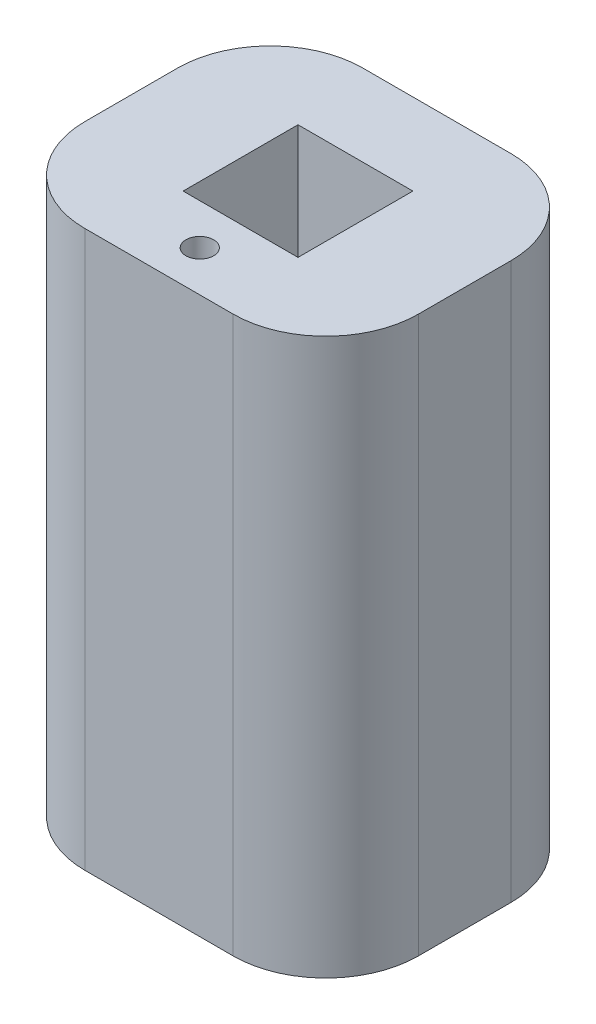
ISO-10303-21;
HEADER;
FILE_DESCRIPTION(('STEP AP214'),'2;1');
FILE_NAME('part.step','',(''),(''),'','','');
FILE_SCHEMA(('AUTOMOTIVE_DESIGN { 1 0 10303 214 1 1 1 1 }'));
ENDSEC;
DATA;
#1=APPLICATION_CONTEXT('core data for automotive mechanical design processes');
#2=APPLICATION_PROTOCOL_DEFINITION('international standard','automotive_design',2000,#1);
#3=PRODUCT_CONTEXT('',#1,'mechanical');
#4=PRODUCT('Part','Part','',(#3));
#5=PRODUCT_RELATED_PRODUCT_CATEGORY('part','',(#4));
#6=PRODUCT_DEFINITION_FORMATION('','',#4);
#7=PRODUCT_DEFINITION_CONTEXT('part definition',#1,'design');
#8=PRODUCT_DEFINITION('design','',#6,#7);
#9=PRODUCT_DEFINITION_SHAPE('','',#8);
#10=(LENGTH_UNIT() NAMED_UNIT(*) SI_UNIT(.MILLI.,.METRE.));
#11=(NAMED_UNIT(*) PLANE_ANGLE_UNIT() SI_UNIT($,.RADIAN.));
#12=(NAMED_UNIT(*) SI_UNIT($,.STERADIAN.) SOLID_ANGLE_UNIT());
#13=UNCERTAINTY_MEASURE_WITH_UNIT(LENGTH_MEASURE(1.E-05),#10,'distance_accuracy_value','');
#14=(GEOMETRIC_REPRESENTATION_CONTEXT(3) GLOBAL_UNCERTAINTY_ASSIGNED_CONTEXT((#13)) GLOBAL_UNIT_ASSIGNED_CONTEXT((#10,
#11,#12)) REPRESENTATION_CONTEXT('',''));
#15=CARTESIAN_POINT('',(0.,0.,0.));
#16=DIRECTION('',(0.,0.,1.));
#17=DIRECTION('',(1.,0.,0.));
#18=AXIS2_PLACEMENT_3D('',#15,#16,#17);
#19=CARTESIAN_POINT('',(-40.554301947245,68.1515906405771,15.));
#20=DIRECTION('',(1.,0.,0.));
#21=DIRECTION('',(0.,1.,0.));
#22=AXIS2_PLACEMENT_3D('',#19,#20,#21);
#23=PLANE('',#22);
#24=DIRECTION('',(0.,0.,-1.));
#25=VECTOR('',#24,1.);
#26=CARTESIAN_POINT('',(-40.554301947245,38.1515906405771,15.));
#27=LINE('',#26,#25);
#28=CARTESIAN_POINT('',(-40.554301947245,38.1515906405771,10.));
#29=VERTEX_POINT('',#28);
#30=CARTESIAN_POINT('',(-40.554301947245,38.1515906405771,5.));
#31=VERTEX_POINT('',#30);
#32=EDGE_CURVE('E190',#29,#31,#27,.T.);
#33=ORIENTED_EDGE('',*,*,#32,.F.);
#34=DIRECTION('',(0.,-1.,0.));
#35=VECTOR('',#34,1.);
#36=CARTESIAN_POINT('',(-40.554301947245,68.1515906405771,10.));
#37=LINE('',#36,#35);
#38=CARTESIAN_POINT('',(-40.554301947245,68.1515906405771,10.));
#39=VERTEX_POINT('',#38);
#40=EDGE_CURVE('E11',#29,#39,#37,.F.);
#41=ORIENTED_EDGE('',*,*,#40,.T.);
#42=DIRECTION('',(0.,0.,-1.));
#43=VECTOR('',#42,1.);
#44=CARTESIAN_POINT('',(-40.554301947245,68.1515906405771,15.));
#45=LINE('',#44,#43);
#46=CARTESIAN_POINT('',(-40.554301947245,68.1515906405771,5.));
#47=VERTEX_POINT('',#46);
#48=EDGE_CURVE('E177',#39,#47,#45,.T.);
#49=ORIENTED_EDGE('',*,*,#48,.T.);
#50=DIRECTION('',(0.,-1.,0.));
#51=VECTOR('',#50,1.);
#52=CARTESIAN_POINT('',(-40.554301947245,38.1515906405771,5.));
#53=LINE('',#52,#51);
#54=EDGE_CURVE('E44',#47,#31,#53,.T.);
#55=ORIENTED_EDGE('',*,*,#54,.T.);
#56=EDGE_LOOP('',(#33,#41,#49,#55));
#57=FACE_BOUND('',#56,.T.);
#58=ADVANCED_FACE('F35',(#57),#23,.F.);
#59=CARTESIAN_POINT('',(-22.554301947245,38.1515906405771,15.));
#60=DIRECTION('',(0.,1.,0.));
#61=DIRECTION('',(0.,0.,1.));
#62=AXIS2_PLACEMENT_3D('',#59,#60,#61);
#63=PLANE('',#62);
#64=CARTESIAN_POINT('',(-31.554301947245,38.1515906405771,12.8));
#65=DIRECTION('',(0.,-1.,0.));
#66=DIRECTION('',(0.,0.,-1.));
#67=AXIS2_PLACEMENT_3D('',#64,#65,#66);
#68=CIRCLE('',#67,0.750000000000002);
#69=CARTESIAN_POINT('',(-31.554301947245,38.1515906405771,12.05));
#70=VERTEX_POINT('',#69);
#71=EDGE_CURVE('E398',#70,#70,#68,.T.);
#72=ORIENTED_EDGE('',*,*,#71,.F.);
#73=EDGE_LOOP('',(#72));
#74=FACE_BOUND('',#73,.T.);
#75=DIRECTION('',(-1.,0.,0.));
#76=VECTOR('',#75,1.);
#77=CARTESIAN_POINT('',(-34.654301947245,38.1515906405771,10.6));
#78=LINE('',#77,#76);
#79=CARTESIAN_POINT('',(-28.454301947245,38.1515906405771,10.6));
#80=VERTEX_POINT('',#79);
#81=CARTESIAN_POINT('',(-34.654301947245,38.1515906405771,10.6));
#82=VERTEX_POINT('',#81);
#83=EDGE_CURVE('E134',#80,#82,#78,.T.);
#84=ORIENTED_EDGE('',*,*,#83,.F.);
#85=DIRECTION('',(0.,0.,1.));
#86=VECTOR('',#85,1.);
#87=CARTESIAN_POINT('',(-28.454301947245,38.1515906405771,4.4));
#88=LINE('',#87,#86);
#89=CARTESIAN_POINT('',(-28.454301947245,38.1515906405771,4.4));
#90=VERTEX_POINT('',#89);
#91=EDGE_CURVE('E154',#90,#80,#88,.T.);
#92=ORIENTED_EDGE('',*,*,#91,.F.);
#93=DIRECTION('',(1.,0.,0.));
#94=VECTOR('',#93,1.);
#95=CARTESIAN_POINT('',(-34.654301947245,38.1515906405771,4.4));
#96=LINE('',#95,#94);
#97=CARTESIAN_POINT('',(-34.654301947245,38.1515906405771,4.4));
#98=VERTEX_POINT('',#97);
#99=EDGE_CURVE('E162',#98,#90,#96,.T.);
#100=ORIENTED_EDGE('',*,*,#99,.F.);
#101=DIRECTION('',(0.,0.,-1.));
#102=VECTOR('',#101,1.);
#103=CARTESIAN_POINT('',(-34.654301947245,38.1515906405771,4.4));
#104=LINE('',#103,#102);
#105=EDGE_CURVE('E160',#82,#98,#104,.T.);
#106=ORIENTED_EDGE('',*,*,#105,.F.);
#107=EDGE_LOOP('',(#84,#92,#100,#106));
#108=FACE_BOUND('',#107,.T.);
#109=DIRECTION('',(0.,0.,-1.));
#110=VECTOR('',#109,1.);
#111=CARTESIAN_POINT('',(-22.554301947245,38.1515906405771,15.));
#112=LINE('',#111,#110);
#113=CARTESIAN_POINT('',(-22.554301947245,38.1515906405771,10.));
#114=VERTEX_POINT('',#113);
#115=CARTESIAN_POINT('',(-22.554301947245,38.1515906405771,5.));
#116=VERTEX_POINT('',#115);
#117=EDGE_CURVE('E187',#114,#116,#112,.T.);
#118=ORIENTED_EDGE('',*,*,#117,.F.);
#119=CARTESIAN_POINT('',(-27.554301947245,38.1515906405771,10.));
#120=DIRECTION('',(0.,1.,0.));
#121=DIRECTION('',(0.,0.,1.));
#122=AXIS2_PLACEMENT_3D('',#119,#120,#121);
#123=CIRCLE('',#122,5.);
#124=CARTESIAN_POINT('',(-27.554301947245,38.1515906405771,15.));
#125=VERTEX_POINT('',#124);
#126=EDGE_CURVE('E215',#114,#125,#123,.F.);
#127=ORIENTED_EDGE('',*,*,#126,.T.);
#128=DIRECTION('',(1.,0.,0.));
#129=VECTOR('',#128,1.);
#130=CARTESIAN_POINT('',(-22.554301947245,38.1515906405771,15.));
#131=LINE('',#130,#129);
#132=CARTESIAN_POINT('',(-35.554301947245,38.1515906405771,15.));
#133=VERTEX_POINT('',#132);
#134=EDGE_CURVE('E170',#133,#125,#131,.T.);
#135=ORIENTED_EDGE('',*,*,#134,.F.);
#136=CARTESIAN_POINT('',(-35.554301947245,38.1515906405771,10.));
#137=DIRECTION('',(0.,1.,0.));
#138=DIRECTION('',(0.,0.,1.));
#139=AXIS2_PLACEMENT_3D('',#136,#137,#138);
#140=CIRCLE('',#139,5.);
#141=EDGE_CURVE('E59',#133,#29,#140,.F.);
#142=ORIENTED_EDGE('',*,*,#141,.T.);
#143=ORIENTED_EDGE('',*,*,#32,.T.);
#144=CARTESIAN_POINT('',(-35.554301947245,38.1515906405771,5.));
#145=DIRECTION('',(0.,1.,0.));
#146=DIRECTION('',(0.,0.,1.));
#147=AXIS2_PLACEMENT_3D('',#144,#145,#146);
#148=CIRCLE('',#147,5.);
#149=CARTESIAN_POINT('',(-35.554301947245,38.1515906405771,0.));
#150=VERTEX_POINT('',#149);
#151=EDGE_CURVE('E51',#31,#150,#148,.F.);
#152=ORIENTED_EDGE('',*,*,#151,.T.);
#153=DIRECTION('',(1.,0.,0.));
#154=VECTOR('',#153,1.);
#155=CARTESIAN_POINT('',(-22.554301947245,38.1515906405771,0.));
#156=LINE('',#155,#154);
#157=CARTESIAN_POINT('',(-27.554301947245,38.1515906405771,0.));
#158=VERTEX_POINT('',#157);
#159=EDGE_CURVE('E167',#150,#158,#156,.T.);
#160=ORIENTED_EDGE('',*,*,#159,.T.);
#161=CARTESIAN_POINT('',(-27.554301947245,38.1515906405771,5.));
#162=DIRECTION('',(0.,1.,0.));
#163=DIRECTION('',(0.,0.,1.));
#164=AXIS2_PLACEMENT_3D('',#161,#162,#163);
#165=CIRCLE('',#164,5.);
#166=EDGE_CURVE('E213',#158,#116,#165,.F.);
#167=ORIENTED_EDGE('',*,*,#166,.T.);
#168=EDGE_LOOP('',(#118,#127,#135,#142,#143,#152,#160,#167));
#169=FACE_BOUND('',#168,.T.);
#170=ADVANCED_FACE('F226',(#74,#108,#169),#63,.F.);
#171=CARTESIAN_POINT('',(-22.554301947245,68.1515906405771,15.));
#172=DIRECTION('',(-1.,0.,0.));
#173=DIRECTION('',(0.,0.,1.));
#174=AXIS2_PLACEMENT_3D('',#171,#172,#173);
#175=PLANE('',#174);
#176=DIRECTION('',(0.,0.,-1.));
#177=VECTOR('',#176,1.);
#178=CARTESIAN_POINT('',(-22.554301947245,68.1515906405771,15.));
#179=LINE('',#178,#177);
#180=CARTESIAN_POINT('',(-22.554301947245,68.1515906405771,10.));
#181=VERTEX_POINT('',#180);
#182=CARTESIAN_POINT('',(-22.554301947245,68.1515906405771,5.));
#183=VERTEX_POINT('',#182);
#184=EDGE_CURVE('E184',#181,#183,#179,.T.);
#185=ORIENTED_EDGE('',*,*,#184,.F.);
#186=DIRECTION('',(0.,1.,0.));
#187=VECTOR('',#186,1.);
#188=CARTESIAN_POINT('',(-22.554301947245,68.1515906405771,10.));
#189=LINE('',#188,#187);
#190=EDGE_CURVE('E209',#181,#114,#189,.F.);
#191=ORIENTED_EDGE('',*,*,#190,.T.);
#192=ORIENTED_EDGE('',*,*,#117,.T.);
#193=DIRECTION('',(0.,1.,0.));
#194=VECTOR('',#193,1.);
#195=CARTESIAN_POINT('',(-22.554301947245,68.1515906405771,5.));
#196=LINE('',#195,#194);
#197=EDGE_CURVE('E206',#116,#183,#196,.T.);
#198=ORIENTED_EDGE('',*,*,#197,.T.);
#199=EDGE_LOOP('',(#185,#191,#192,#198));
#200=FACE_BOUND('',#199,.T.);
#201=ADVANCED_FACE('F241',(#200),#175,.F.);
#202=CARTESIAN_POINT('',(-22.554301947245,68.1515906405771,15.));
#203=DIRECTION('',(0.,-1.,0.));
#204=DIRECTION('',(0.,0.,-1.));
#205=AXIS2_PLACEMENT_3D('',#202,#203,#204);
#206=PLANE('',#205);
#207=CARTESIAN_POINT('',(-31.554301947245,68.1515906405771,12.8));
#208=DIRECTION('',(0.,-1.,0.));
#209=DIRECTION('',(0.,0.,-1.));
#210=AXIS2_PLACEMENT_3D('',#207,#208,#209);
#211=CIRCLE('',#210,0.750000000000002);
#212=CARTESIAN_POINT('',(-31.554301947245,68.1515906405771,12.05));
#213=VERTEX_POINT('',#212);
#214=EDGE_CURVE('E39',#213,#213,#211,.T.);
#215=ORIENTED_EDGE('',*,*,#214,.T.);
#216=EDGE_LOOP('',(#215));
#217=FACE_BOUND('',#216,.T.);
#218=DIRECTION('',(0.,0.,1.));
#219=VECTOR('',#218,1.);
#220=CARTESIAN_POINT('',(-34.654301947245,68.1515906405771,4.4));
#221=LINE('',#220,#219);
#222=CARTESIAN_POINT('',(-34.654301947245,68.1515906405771,4.4));
#223=VERTEX_POINT('',#222);
#224=CARTESIAN_POINT('',(-34.654301947245,68.1515906405771,10.6));
#225=VERTEX_POINT('',#224);
#226=EDGE_CURVE('E142',#223,#225,#221,.T.);
#227=ORIENTED_EDGE('',*,*,#226,.F.);
#228=DIRECTION('',(-1.,0.,0.));
#229=VECTOR('',#228,1.);
#230=CARTESIAN_POINT('',(-28.454301947245,68.1515906405771,4.4));
#231=LINE('',#230,#229);
#232=CARTESIAN_POINT('',(-28.454301947245,68.1515906405771,4.4));
#233=VERTEX_POINT('',#232);
#234=EDGE_CURVE('E147',#233,#223,#231,.T.);
#235=ORIENTED_EDGE('',*,*,#234,.F.);
#236=DIRECTION('',(0.,0.,-1.));
#237=VECTOR('',#236,1.);
#238=CARTESIAN_POINT('',(-28.454301947245,68.1515906405771,10.6));
#239=LINE('',#238,#237);
#240=CARTESIAN_POINT('',(-28.454301947245,68.1515906405771,10.6));
#241=VERTEX_POINT('',#240);
#242=EDGE_CURVE('E152',#241,#233,#239,.T.);
#243=ORIENTED_EDGE('',*,*,#242,.F.);
#244=DIRECTION('',(1.,0.,0.));
#245=VECTOR('',#244,1.);
#246=CARTESIAN_POINT('',(-34.654301947245,68.1515906405771,10.6));
#247=LINE('',#246,#245);
#248=EDGE_CURVE('E131',#225,#241,#247,.T.);
#249=ORIENTED_EDGE('',*,*,#248,.F.);
#250=EDGE_LOOP('',(#227,#235,#243,#249));
#251=FACE_BOUND('',#250,.T.);
#252=DIRECTION('',(-1.,0.,0.));
#253=VECTOR('',#252,1.);
#254=CARTESIAN_POINT('',(-22.554301947245,68.1515906405771,15.));
#255=LINE('',#254,#253);
#256=CARTESIAN_POINT('',(-27.554301947245,68.1515906405771,15.));
#257=VERTEX_POINT('',#256);
#258=CARTESIAN_POINT('',(-35.554301947245,68.1515906405771,15.));
#259=VERTEX_POINT('',#258);
#260=EDGE_CURVE('E173',#257,#259,#255,.T.);
#261=ORIENTED_EDGE('',*,*,#260,.F.);
#262=CARTESIAN_POINT('',(-27.554301947245,68.1515906405771,10.));
#263=DIRECTION('',(0.,-1.,0.));
#264=DIRECTION('',(0.,0.,-1.));
#265=AXIS2_PLACEMENT_3D('',#262,#263,#264);
#266=CIRCLE('',#265,5.);
#267=EDGE_CURVE('E204',#257,#181,#266,.F.);
#268=ORIENTED_EDGE('',*,*,#267,.T.);
#269=ORIENTED_EDGE('',*,*,#184,.T.);
#270=CARTESIAN_POINT('',(-27.554301947245,68.1515906405771,5.));
#271=DIRECTION('',(0.,-1.,0.));
#272=DIRECTION('',(0.,0.,-1.));
#273=AXIS2_PLACEMENT_3D('',#270,#271,#272);
#274=CIRCLE('',#273,5.);
#275=CARTESIAN_POINT('',(-27.554301947245,68.1515906405771,0.));
#276=VERTEX_POINT('',#275);
#277=EDGE_CURVE('E202',#183,#276,#274,.F.);
#278=ORIENTED_EDGE('',*,*,#277,.T.);
#279=DIRECTION('',(-1.,0.,0.));
#280=VECTOR('',#279,1.);
#281=CARTESIAN_POINT('',(-22.554301947245,68.1515906405771,0.));
#282=LINE('',#281,#280);
#283=CARTESIAN_POINT('',(-35.554301947245,68.1515906405771,0.));
#284=VERTEX_POINT('',#283);
#285=EDGE_CURVE('E174',#276,#284,#282,.T.);
#286=ORIENTED_EDGE('',*,*,#285,.T.);
#287=CARTESIAN_POINT('',(-35.554301947245,68.1515906405771,5.));
#288=DIRECTION('',(0.,-1.,0.));
#289=DIRECTION('',(0.,0.,-1.));
#290=AXIS2_PLACEMENT_3D('',#287,#288,#289);
#291=CIRCLE('',#290,5.);
#292=EDGE_CURVE('E198',#284,#47,#291,.F.);
#293=ORIENTED_EDGE('',*,*,#292,.T.);
#294=ORIENTED_EDGE('',*,*,#48,.F.);
#295=CARTESIAN_POINT('',(-35.554301947245,68.1515906405771,10.));
#296=DIRECTION('',(0.,-1.,0.));
#297=DIRECTION('',(0.,0.,-1.));
#298=AXIS2_PLACEMENT_3D('',#295,#296,#297);
#299=CIRCLE('',#298,5.);
#300=EDGE_CURVE('E200',#39,#259,#299,.F.);
#301=ORIENTED_EDGE('',*,*,#300,.T.);
#302=EDGE_LOOP('',(#261,#268,#269,#278,#286,#293,#294,#301));
#303=FACE_BOUND('',#302,.T.);
#304=ADVANCED_FACE('F149',(#217,#251,#303),#206,.F.);
#305=CARTESIAN_POINT('',(0.,0.,15.));
#306=DIRECTION('',(0.,0.,-1.));
#307=DIRECTION('',(-1.,0.,0.));
#308=AXIS2_PLACEMENT_3D('',#305,#306,#307);
#309=PLANE('',#308);
#310=ORIENTED_EDGE('',*,*,#134,.T.);
#311=DIRECTION('',(0.,1.,0.));
#312=VECTOR('',#311,1.);
#313=CARTESIAN_POINT('',(-27.554301947245,0.,15.));
#314=LINE('',#313,#312);
#315=EDGE_CURVE('E195',#125,#257,#314,.T.);
#316=ORIENTED_EDGE('',*,*,#315,.T.);
#317=ORIENTED_EDGE('',*,*,#260,.T.);
#318=DIRECTION('',(0.,-1.,0.));
#319=VECTOR('',#318,1.);
#320=CARTESIAN_POINT('',(-35.5543019472449,0.,15.));
#321=LINE('',#320,#319);
#322=EDGE_CURVE('E192',#259,#133,#321,.T.);
#323=ORIENTED_EDGE('',*,*,#322,.T.);
#324=EDGE_LOOP('',(#310,#316,#317,#323));
#325=FACE_BOUND('',#324,.T.);
#326=ADVANCED_FACE('F247',(#325),#309,.F.);
#327=CARTESIAN_POINT('',(0.,0.,0.));
#328=DIRECTION('',(0.,0.,-1.));
#329=DIRECTION('',(-1.,0.,0.));
#330=AXIS2_PLACEMENT_3D('',#327,#328,#329);
#331=PLANE('',#330);
#332=ORIENTED_EDGE('',*,*,#285,.F.);
#333=DIRECTION('',(0.,1.,0.));
#334=VECTOR('',#333,1.);
#335=CARTESIAN_POINT('',(-27.554301947245,38.1515906405771,0.));
#336=LINE('',#335,#334);
#337=EDGE_CURVE('E219',#276,#158,#336,.F.);
#338=ORIENTED_EDGE('',*,*,#337,.T.);
#339=ORIENTED_EDGE('',*,*,#159,.F.);
#340=DIRECTION('',(0.,-1.,0.));
#341=VECTOR('',#340,1.);
#342=CARTESIAN_POINT('',(-35.554301947245,68.1515906405771,0.));
#343=LINE('',#342,#341);
#344=EDGE_CURVE('E217',#150,#284,#343,.F.);
#345=ORIENTED_EDGE('',*,*,#344,.T.);
#346=EDGE_LOOP('',(#332,#338,#339,#345));
#347=FACE_BOUND('',#346,.T.);
#348=ADVANCED_FACE('F231',(#347),#331,.T.);
#349=CARTESIAN_POINT('',(-28.454301947245,41.4015906405771,4.4));
#350=DIRECTION('',(1.,0.,0.));
#351=DIRECTION('',(0.,0.,-1.));
#352=AXIS2_PLACEMENT_3D('',#349,#350,#351);
#353=PLANE('',#352);
#354=ORIENTED_EDGE('',*,*,#91,.T.);
#355=DIRECTION('',(0.,-1.,0.));
#356=VECTOR('',#355,1.);
#357=CARTESIAN_POINT('',(-28.454301947245,41.4015906405771,10.6));
#358=LINE('',#357,#356);
#359=EDGE_CURVE('E139',#241,#80,#358,.T.);
#360=ORIENTED_EDGE('',*,*,#359,.F.);
#361=ORIENTED_EDGE('',*,*,#242,.T.);
#362=DIRECTION('',(0.,-1.,0.));
#363=VECTOR('',#362,1.);
#364=CARTESIAN_POINT('',(-28.454301947245,41.4015906405771,4.4));
#365=LINE('',#364,#363);
#366=EDGE_CURVE('E165',#233,#90,#365,.T.);
#367=ORIENTED_EDGE('',*,*,#366,.T.);
#368=EDGE_LOOP('',(#354,#360,#361,#367));
#369=FACE_BOUND('',#368,.T.);
#370=ADVANCED_FACE('F279',(#369),#353,.F.);
#371=CARTESIAN_POINT('',(-34.654301947245,41.4015906405771,4.4));
#372=DIRECTION('',(0.,0.,-1.));
#373=DIRECTION('',(-1.,0.,0.));
#374=AXIS2_PLACEMENT_3D('',#371,#372,#373);
#375=PLANE('',#374);
#376=ORIENTED_EDGE('',*,*,#99,.T.);
#377=ORIENTED_EDGE('',*,*,#366,.F.);
#378=ORIENTED_EDGE('',*,*,#234,.T.);
#379=DIRECTION('',(0.,-1.,0.));
#380=VECTOR('',#379,1.);
#381=CARTESIAN_POINT('',(-34.654301947245,41.4015906405771,4.4));
#382=LINE('',#381,#380);
#383=EDGE_CURVE('E138',#223,#98,#382,.T.);
#384=ORIENTED_EDGE('',*,*,#383,.T.);
#385=EDGE_LOOP('',(#376,#377,#378,#384));
#386=FACE_BOUND('',#385,.T.);
#387=ADVANCED_FACE('F275',(#386),#375,.F.);
#388=CARTESIAN_POINT('',(-34.654301947245,41.4015906405771,4.4));
#389=DIRECTION('',(-1.,0.,0.));
#390=DIRECTION('',(0.,0.,1.));
#391=AXIS2_PLACEMENT_3D('',#388,#389,#390);
#392=PLANE('',#391);
#393=ORIENTED_EDGE('',*,*,#105,.T.);
#394=ORIENTED_EDGE('',*,*,#383,.F.);
#395=ORIENTED_EDGE('',*,*,#226,.T.);
#396=DIRECTION('',(0.,-1.,0.));
#397=VECTOR('',#396,1.);
#398=CARTESIAN_POINT('',(-34.654301947245,41.4015906405771,10.6));
#399=LINE('',#398,#397);
#400=EDGE_CURVE('E126',#225,#82,#399,.T.);
#401=ORIENTED_EDGE('',*,*,#400,.T.);
#402=EDGE_LOOP('',(#393,#394,#395,#401));
#403=FACE_BOUND('',#402,.T.);
#404=ADVANCED_FACE('F143',(#403),#392,.F.);
#405=CARTESIAN_POINT('',(-34.654301947245,41.4015906405771,10.6));
#406=DIRECTION('',(0.,0.,1.));
#407=DIRECTION('',(1.,0.,0.));
#408=AXIS2_PLACEMENT_3D('',#405,#406,#407);
#409=PLANE('',#408);
#410=ORIENTED_EDGE('',*,*,#83,.T.);
#411=ORIENTED_EDGE('',*,*,#400,.F.);
#412=ORIENTED_EDGE('',*,*,#248,.T.);
#413=ORIENTED_EDGE('',*,*,#359,.T.);
#414=EDGE_LOOP('',(#410,#411,#412,#413));
#415=FACE_BOUND('',#414,.T.);
#416=ADVANCED_FACE('F128',(#415),#409,.F.);
#417=CARTESIAN_POINT('',(-27.554301947245,0.,10.));
#418=DIRECTION('',(0.,1.,0.));
#419=DIRECTION('',(0.,0.,1.));
#420=AXIS2_PLACEMENT_3D('',#417,#418,#419);
#421=CYLINDRICAL_SURFACE('',#420,5.);
#422=ORIENTED_EDGE('',*,*,#126,.F.);
#423=ORIENTED_EDGE('',*,*,#190,.F.);
#424=ORIENTED_EDGE('',*,*,#267,.F.);
#425=ORIENTED_EDGE('',*,*,#315,.F.);
#426=EDGE_LOOP('',(#422,#423,#424,#425));
#427=FACE_BOUND('',#426,.T.);
#428=ADVANCED_FACE('F244',(#427),#421,.T.);
#429=CARTESIAN_POINT('',(-27.554301947245,68.1515906405771,5.));
#430=DIRECTION('',(0.,-1.,0.));
#431=DIRECTION('',(0.,0.,-1.));
#432=AXIS2_PLACEMENT_3D('',#429,#430,#431);
#433=CYLINDRICAL_SURFACE('',#432,5.);
#434=ORIENTED_EDGE('',*,*,#166,.F.);
#435=ORIENTED_EDGE('',*,*,#337,.F.);
#436=ORIENTED_EDGE('',*,*,#277,.F.);
#437=ORIENTED_EDGE('',*,*,#197,.F.);
#438=EDGE_LOOP('',(#434,#435,#436,#437));
#439=FACE_BOUND('',#438,.T.);
#440=ADVANCED_FACE('F236',(#439),#433,.T.);
#441=CARTESIAN_POINT('',(-35.5543019472449,0.,10.));
#442=DIRECTION('',(0.,-1.,0.));
#443=DIRECTION('',(1.,0.,0.));
#444=AXIS2_PLACEMENT_3D('',#441,#442,#443);
#445=CYLINDRICAL_SURFACE('',#444,5.);
#446=ORIENTED_EDGE('',*,*,#300,.F.);
#447=ORIENTED_EDGE('',*,*,#40,.F.);
#448=ORIENTED_EDGE('',*,*,#141,.F.);
#449=ORIENTED_EDGE('',*,*,#322,.F.);
#450=EDGE_LOOP('',(#446,#447,#448,#449));
#451=FACE_BOUND('',#450,.T.);
#452=ADVANCED_FACE('F250',(#451),#445,.T.);
#453=CARTESIAN_POINT('',(-35.554301947245,68.1515906405771,5.));
#454=DIRECTION('',(0.,1.,0.));
#455=DIRECTION('',(-1.,0.,0.));
#456=AXIS2_PLACEMENT_3D('',#453,#454,#455);
#457=CYLINDRICAL_SURFACE('',#456,5.);
#458=ORIENTED_EDGE('',*,*,#292,.F.);
#459=ORIENTED_EDGE('',*,*,#344,.F.);
#460=ORIENTED_EDGE('',*,*,#151,.F.);
#461=ORIENTED_EDGE('',*,*,#54,.F.);
#462=EDGE_LOOP('',(#458,#459,#460,#461));
#463=FACE_BOUND('',#462,.T.);
#464=ADVANCED_FACE('F37',(#463),#457,.T.);
#465=CARTESIAN_POINT('',(-31.554301947245,83.1515906405772,12.8));
#466=DIRECTION('',(0.,-1.,0.));
#467=DIRECTION('',(0.,0.,-1.));
#468=AXIS2_PLACEMENT_3D('',#465,#466,#467);
#469=CYLINDRICAL_SURFACE('',#468,0.750000000000002);
#470=ORIENTED_EDGE('',*,*,#71,.T.);
#471=EDGE_LOOP('',(#470));
#472=FACE_BOUND('',#471,.T.);
#473=ORIENTED_EDGE('',*,*,#214,.F.);
#474=EDGE_LOOP('',(#473));
#475=FACE_BOUND('',#474,.T.);
#476=ADVANCED_FACE('F256',(#472,#475),#469,.F.);
#477=CLOSED_SHELL('',(#58,#170,#201,#304,#326,#348,#370,#387,#404,#416,#428,#440,#452,#464,#476));
#478=MANIFOLD_SOLID_BREP('B2',#477);
#479=ADVANCED_BREP_SHAPE_REPRESENTATION('',(#18,#478),#14);
#480=SHAPE_DEFINITION_REPRESENTATION(#9,#479);
ENDSEC;
END-ISO-10303-21;
